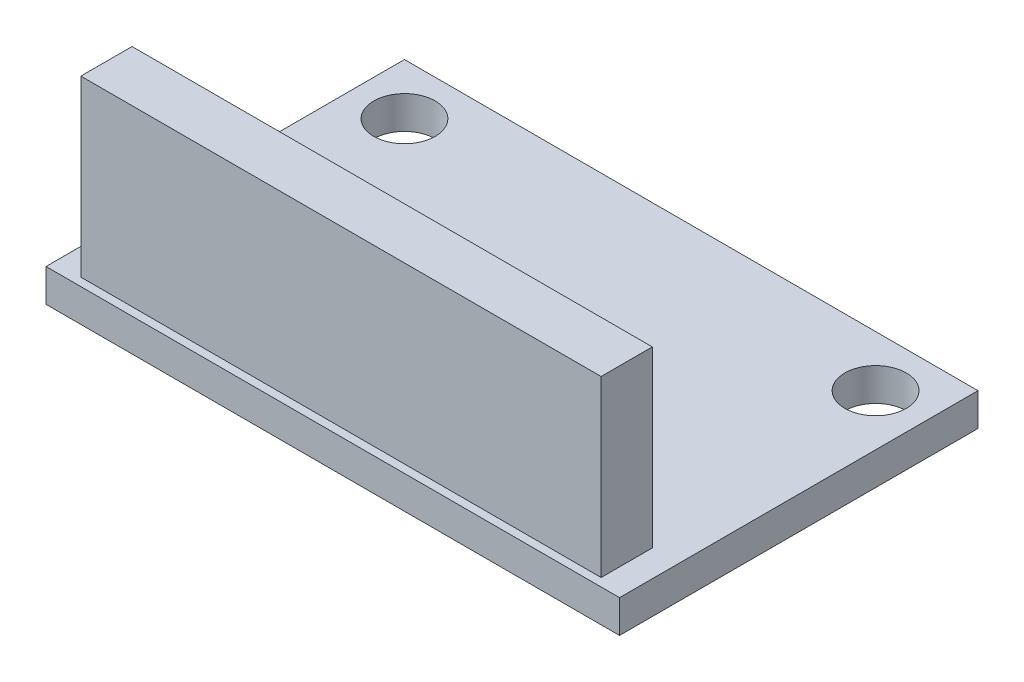
ISO-10303-21;
HEADER;
FILE_DESCRIPTION(('STEP AP214'),'2;1');
FILE_NAME('part.step','',(''),(''),'','','');
FILE_SCHEMA(('AUTOMOTIVE_DESIGN { 1 0 10303 214 1 1 1 1 }'));
ENDSEC;
DATA;
#1=APPLICATION_CONTEXT('core data for automotive mechanical design processes');
#2=APPLICATION_PROTOCOL_DEFINITION('international standard','automotive_design',2000,#1);
#3=PRODUCT_CONTEXT('',#1,'mechanical');
#4=PRODUCT('Part','Part','',(#3));
#5=PRODUCT_RELATED_PRODUCT_CATEGORY('part','',(#4));
#6=PRODUCT_DEFINITION_FORMATION('','',#4);
#7=PRODUCT_DEFINITION_CONTEXT('part definition',#1,'design');
#8=PRODUCT_DEFINITION('design','',#6,#7);
#9=PRODUCT_DEFINITION_SHAPE('','',#8);
#10=(LENGTH_UNIT() NAMED_UNIT(*) SI_UNIT(.MILLI.,.METRE.));
#11=(NAMED_UNIT(*) PLANE_ANGLE_UNIT() SI_UNIT($,.RADIAN.));
#12=(NAMED_UNIT(*) SI_UNIT($,.STERADIAN.) SOLID_ANGLE_UNIT());
#13=UNCERTAINTY_MEASURE_WITH_UNIT(LENGTH_MEASURE(1.E-05),#10,'distance_accuracy_value','');
#14=(GEOMETRIC_REPRESENTATION_CONTEXT(3) GLOBAL_UNCERTAINTY_ASSIGNED_CONTEXT((#13)) GLOBAL_UNIT_ASSIGNED_CONTEXT((#10,
#11,#12)) REPRESENTATION_CONTEXT('',''));
#15=CARTESIAN_POINT('',(0.,0.,0.));
#16=DIRECTION('',(0.,0.,1.));
#17=DIRECTION('',(1.,0.,0.));
#18=AXIS2_PLACEMENT_3D('',#15,#16,#17);
#19=CARTESIAN_POINT('',(0.,1.6,0.));
#20=DIRECTION('',(0.,-1.,0.));
#21=DIRECTION('',(0.,0.,-1.));
#22=AXIS2_PLACEMENT_3D('',#19,#20,#21);
#23=PLANE('',#22);
#24=DIRECTION('',(0.,0.,1.));
#25=VECTOR('',#24,1.);
#26=CARTESIAN_POINT('',(11.,1.6,-6.5));
#27=LINE('',#26,#25);
#28=CARTESIAN_POINT('',(11.,1.6,-9.5));
#29=VERTEX_POINT('',#28);
#30=CARTESIAN_POINT('',(11.,1.6,-6.5));
#31=VERTEX_POINT('',#30);
#32=EDGE_CURVE('E193',#29,#31,#27,.T.);
#33=ORIENTED_EDGE('',*,*,#32,.F.);
#34=DIRECTION('',(-1.,0.,0.));
#35=VECTOR('',#34,1.);
#36=CARTESIAN_POINT('',(11.,1.6,-9.5));
#37=LINE('',#36,#35);
#38=CARTESIAN_POINT('',(16.,1.6,-9.5));
#39=VERTEX_POINT('',#38);
#40=EDGE_CURVE('E210',#39,#29,#37,.T.);
#41=ORIENTED_EDGE('',*,*,#40,.F.);
#42=DIRECTION('',(0.,0.,-1.));
#43=VECTOR('',#42,1.);
#44=CARTESIAN_POINT('',(16.,1.6,-6.5));
#45=LINE('',#44,#43);
#46=CARTESIAN_POINT('',(16.,1.6,-6.5));
#47=VERTEX_POINT('',#46);
#48=EDGE_CURVE('E219',#47,#39,#45,.T.);
#49=ORIENTED_EDGE('',*,*,#48,.F.);
#50=DIRECTION('',(1.,0.,0.));
#51=VECTOR('',#50,1.);
#52=CARTESIAN_POINT('',(11.,1.6,-6.5));
#53=LINE('',#52,#51);
#54=EDGE_CURVE('E198',#31,#47,#53,.T.);
#55=ORIENTED_EDGE('',*,*,#54,.F.);
#56=EDGE_LOOP('',(#33,#41,#49,#55));
#57=FACE_BOUND('',#56,.T.);
#58=DIRECTION('',(0.,0.,1.));
#59=VECTOR('',#58,1.);
#60=CARTESIAN_POINT('',(0.,1.6,0.));
#61=LINE('',#60,#59);
#62=CARTESIAN_POINT('',(0.,1.6,-17.5));
#63=VERTEX_POINT('',#62);
#64=CARTESIAN_POINT('',(0.,1.6,0.));
#65=VERTEX_POINT('',#64);
#66=EDGE_CURVE('E306',#63,#65,#61,.T.);
#67=ORIENTED_EDGE('',*,*,#66,.T.);
#68=DIRECTION('',(1.,0.,0.));
#69=VECTOR('',#68,1.);
#70=CARTESIAN_POINT('',(0.,1.6,0.));
#71=LINE('',#70,#69);
#72=CARTESIAN_POINT('',(28.,1.6,0.));
#73=VERTEX_POINT('',#72);
#74=EDGE_CURVE('E382',#65,#73,#71,.T.);
#75=ORIENTED_EDGE('',*,*,#74,.T.);
#76=DIRECTION('',(0.,0.,-1.));
#77=VECTOR('',#76,1.);
#78=CARTESIAN_POINT('',(28.,1.6,0.));
#79=LINE('',#78,#77);
#80=CARTESIAN_POINT('',(28.,1.6,-17.5));
#81=VERTEX_POINT('',#80);
#82=EDGE_CURVE('E356',#73,#81,#79,.T.);
#83=ORIENTED_EDGE('',*,*,#82,.T.);
#84=DIRECTION('',(-1.,0.,0.));
#85=VECTOR('',#84,1.);
#86=CARTESIAN_POINT('',(0.,1.6,-17.5));
#87=LINE('',#86,#85);
#88=EDGE_CURVE('E374',#81,#63,#87,.T.);
#89=ORIENTED_EDGE('',*,*,#88,.T.);
#90=EDGE_LOOP('',(#67,#75,#83,#89));
#91=FACE_BOUND('',#90,.T.);
#92=CARTESIAN_POINT('',(2.5,1.6,-15.));
#93=DIRECTION('',(0.,1.,0.));
#94=DIRECTION('',(0.,0.,1.));
#95=AXIS2_PLACEMENT_3D('',#92,#93,#94);
#96=CIRCLE('',#95,1.5);
#97=CARTESIAN_POINT('',(2.5,1.6,-13.5));
#98=VERTEX_POINT('',#97);
#99=EDGE_CURVE('E293',#98,#98,#96,.T.);
#100=ORIENTED_EDGE('',*,*,#99,.F.);
#101=EDGE_LOOP('',(#100));
#102=FACE_BOUND('',#101,.T.);
#103=CARTESIAN_POINT('',(25.5,1.6,-15.));
#104=DIRECTION('',(0.,1.,0.));
#105=DIRECTION('',(0.,0.,1.));
#106=AXIS2_PLACEMENT_3D('',#103,#104,#105);
#107=CIRCLE('',#106,1.5);
#108=CARTESIAN_POINT('',(25.5,1.6,-13.5));
#109=VERTEX_POINT('',#108);
#110=EDGE_CURVE('E290',#109,#109,#107,.T.);
#111=ORIENTED_EDGE('',*,*,#110,.F.);
#112=EDGE_LOOP('',(#111));
#113=FACE_BOUND('',#112,.T.);
#114=DIRECTION('',(0.,0.,1.));
#115=VECTOR('',#114,1.);
#116=CARTESIAN_POINT('',(1.3,1.6,-0.4));
#117=LINE('',#116,#115);
#118=CARTESIAN_POINT('',(1.3,1.6,-2.9));
#119=VERTEX_POINT('',#118);
#120=CARTESIAN_POINT('',(1.3,1.6,-0.4));
#121=VERTEX_POINT('',#120);
#122=EDGE_CURVE('E245',#119,#121,#117,.T.);
#123=ORIENTED_EDGE('',*,*,#122,.F.);
#124=DIRECTION('',(-1.,0.,0.));
#125=VECTOR('',#124,1.);
#126=CARTESIAN_POINT('',(1.3,1.6,-2.9));
#127=LINE('',#126,#125);
#128=CARTESIAN_POINT('',(26.7,1.6,-2.9));
#129=VERTEX_POINT('',#128);
#130=EDGE_CURVE('E246',#129,#119,#127,.T.);
#131=ORIENTED_EDGE('',*,*,#130,.F.);
#132=DIRECTION('',(0.,0.,-1.));
#133=VECTOR('',#132,1.);
#134=CARTESIAN_POINT('',(26.7,1.6,-0.4));
#135=LINE('',#134,#133);
#136=CARTESIAN_POINT('',(26.7,1.6,-0.4));
#137=VERTEX_POINT('',#136);
#138=EDGE_CURVE('E264',#137,#129,#135,.T.);
#139=ORIENTED_EDGE('',*,*,#138,.F.);
#140=DIRECTION('',(1.,0.,0.));
#141=VECTOR('',#140,1.);
#142=CARTESIAN_POINT('',(1.3,1.6,-0.4));
#143=LINE('',#142,#141);
#144=EDGE_CURVE('E261',#121,#137,#143,.T.);
#145=ORIENTED_EDGE('',*,*,#144,.F.);
#146=EDGE_LOOP('',(#123,#131,#139,#145));
#147=FACE_BOUND('',#146,.T.);
#148=DIRECTION('',(0.,0.,1.));
#149=VECTOR('',#148,1.);
#150=CARTESIAN_POINT('',(17.5,1.6,-6.5));
#151=LINE('',#150,#149);
#152=CARTESIAN_POINT('',(17.5,1.6,-7.7));
#153=VERTEX_POINT('',#152);
#154=CARTESIAN_POINT('',(17.5,1.6,-6.5));
#155=VERTEX_POINT('',#154);
#156=EDGE_CURVE('E188',#153,#155,#151,.T.);
#157=ORIENTED_EDGE('',*,*,#156,.F.);
#158=DIRECTION('',(-1.,0.,0.));
#159=VECTOR('',#158,1.);
#160=CARTESIAN_POINT('',(17.5,1.6,-7.7));
#161=LINE('',#160,#159);
#162=CARTESIAN_POINT('',(19.5,1.6,-7.7));
#163=VERTEX_POINT('',#162);
#164=EDGE_CURVE('E186',#163,#153,#161,.T.);
#165=ORIENTED_EDGE('',*,*,#164,.F.);
#166=DIRECTION('',(0.,0.,-1.));
#167=VECTOR('',#166,1.);
#168=CARTESIAN_POINT('',(19.5,1.6,-6.5));
#169=LINE('',#168,#167);
#170=CARTESIAN_POINT('',(19.5,1.6,-6.5));
#171=VERTEX_POINT('',#170);
#172=EDGE_CURVE('E74',#171,#163,#169,.T.);
#173=ORIENTED_EDGE('',*,*,#172,.F.);
#174=DIRECTION('',(1.,0.,0.));
#175=VECTOR('',#174,1.);
#176=CARTESIAN_POINT('',(17.5,1.6,-6.5));
#177=LINE('',#176,#175);
#178=EDGE_CURVE('E69',#155,#171,#177,.T.);
#179=ORIENTED_EDGE('',*,*,#178,.F.);
#180=EDGE_LOOP('',(#157,#165,#173,#179));
#181=FACE_BOUND('',#180,.T.);
#182=ADVANCED_FACE('F47',(#57,#91,#102,#113,#147,#181),#23,.F.);
#183=CARTESIAN_POINT('',(0.,0.,0.));
#184=DIRECTION('',(0.,-1.,0.));
#185=DIRECTION('',(0.,0.,-1.));
#186=AXIS2_PLACEMENT_3D('',#183,#184,#185);
#187=PLANE('',#186);
#188=CARTESIAN_POINT('',(25.5,0.,-15.));
#189=DIRECTION('',(0.,-1.,0.));
#190=DIRECTION('',(0.,0.,-1.));
#191=AXIS2_PLACEMENT_3D('',#188,#189,#190);
#192=CIRCLE('',#191,1.5);
#193=CARTESIAN_POINT('',(25.5,0.,-16.5));
#194=VERTEX_POINT('',#193);
#195=EDGE_CURVE('E292',#194,#194,#192,.T.);
#196=ORIENTED_EDGE('',*,*,#195,.F.);
#197=EDGE_LOOP('',(#196));
#198=FACE_BOUND('',#197,.T.);
#199=DIRECTION('',(0.,0.,1.));
#200=VECTOR('',#199,1.);
#201=CARTESIAN_POINT('',(0.,0.,0.));
#202=LINE('',#201,#200);
#203=CARTESIAN_POINT('',(0.,0.,-17.5));
#204=VERTEX_POINT('',#203);
#205=CARTESIAN_POINT('',(0.,0.,0.));
#206=VERTEX_POINT('',#205);
#207=EDGE_CURVE('E353',#204,#206,#202,.T.);
#208=ORIENTED_EDGE('',*,*,#207,.F.);
#209=DIRECTION('',(-1.,0.,0.));
#210=VECTOR('',#209,1.);
#211=CARTESIAN_POINT('',(0.,0.,-17.5));
#212=LINE('',#211,#210);
#213=CARTESIAN_POINT('',(28.,0.,-17.5));
#214=VERTEX_POINT('',#213);
#215=EDGE_CURVE('E365',#214,#204,#212,.T.);
#216=ORIENTED_EDGE('',*,*,#215,.F.);
#217=DIRECTION('',(0.,0.,-1.));
#218=VECTOR('',#217,1.);
#219=CARTESIAN_POINT('',(28.,0.,0.));
#220=LINE('',#219,#218);
#221=CARTESIAN_POINT('',(28.,0.,0.));
#222=VERTEX_POINT('',#221);
#223=EDGE_CURVE('E352',#222,#214,#220,.T.);
#224=ORIENTED_EDGE('',*,*,#223,.F.);
#225=DIRECTION('',(1.,0.,0.));
#226=VECTOR('',#225,1.);
#227=CARTESIAN_POINT('',(0.,0.,0.));
#228=LINE('',#227,#226);
#229=EDGE_CURVE('E344',#206,#222,#228,.T.);
#230=ORIENTED_EDGE('',*,*,#229,.F.);
#231=EDGE_LOOP('',(#208,#216,#224,#230));
#232=FACE_BOUND('',#231,.T.);
#233=CARTESIAN_POINT('',(2.5,0.,-13.5));
#234=CARTESIAN_POINT('',(2.52473476852017,0.,-13.4999980826802));
#235=CARTESIAN_POINT('',(2.5494707785275,0.,-13.5005895208856));
#236=CARTESIAN_POINT('',(2.59871128510803,0.,-13.5029702628292));
#237=CARTESIAN_POINT('',(2.62321619008288,0.,-13.5047511511846));
#238=CARTESIAN_POINT('',(2.67199479323902,0.,-13.5095103395863));
#239=CARTESIAN_POINT('',(2.69626903668274,0.,-13.5124830301223));
#240=CARTESIAN_POINT('',(2.74458604299898,0.,-13.5196223185799));
#241=CARTESIAN_POINT('',(2.7686292015088,0.,-13.523786237845));
#242=CARTESIAN_POINT('',(2.81648427918419,0.,-13.5333052012687));
#243=CARTESIAN_POINT('',(2.84029614420126,0.,-13.5386605176519));
#244=CARTESIAN_POINT('',(2.88768916255095,0.,-13.5505591453594));
#245=CARTESIAN_POINT('',(2.91126952247937,0.,-13.5571056152043));
#246=CARTESIAN_POINT('',(2.95820019306488,0.,-13.5713841370317));
#247=CARTESIAN_POINT('',(2.98154870748109,0.,-13.5791220881609));
#248=CARTESIAN_POINT('',(3.02801723618735,0.,-13.5957791895752));
#249=CARTESIAN_POINT('',(3.05113423399139,0.,-13.6047067440334));
#250=CARTESIAN_POINT('',(3.09686336053347,0.,-13.6236328462026));
#251=CARTESIAN_POINT('',(3.11947652911217,0.,-13.6336288808049));
#252=CARTESIAN_POINT('',(3.16403406458079,0.,-13.6546460447501));
#253=CARTESIAN_POINT('',(3.18598193419866,0.,-13.6656597395951));
#254=CARTESIAN_POINT('',(3.22921011776691,0.,-13.6887078701635));
#255=CARTESIAN_POINT('',(3.25049296316462,0.,-13.7007375562716));
#256=CARTESIAN_POINT('',(3.2923920024617,0.,-13.7258153814986));
#257=CARTESIAN_POINT('',(3.31300944998675,0.,-13.7388614255848));
#258=CARTESIAN_POINT('',(3.35357904909081,0.,-13.7659692031202));
#259=CARTESIAN_POINT('',(3.37353089224229,0.,-13.7800313981341));
#260=CARTESIAN_POINT('',(3.41277098771515,0.,-13.8091688454879));
#261=CARTESIAN_POINT('',(3.43205712993003,0.,-13.8242469388043));
#262=CARTESIAN_POINT('',(3.46996730836356,0.,-13.855414262553));
#263=CARTESIAN_POINT('',(3.48858724864184,0.,-13.8715084726161));
#264=CARTESIAN_POINT('',(3.52516839349348,0.,-13.9047043306774));
#265=CARTESIAN_POINT('',(3.54312341285186,0.,-13.9218127889286));
#266=CARTESIAN_POINT('',(3.57814252919733,0.,-13.956812496153));
#267=CARTESIAN_POINT('',(3.59520921716561,0.,-13.9747011521588));
#268=CARTESIAN_POINT('',(3.62833220882842,0.,-14.0111697936334));
#269=CARTESIAN_POINT('',(3.64439459506978,0.,-14.0297442495724));
#270=CARTESIAN_POINT('',(3.67551206025703,0.,-14.0675806863673));
#271=CARTESIAN_POINT('',(3.69057129531392,0.,-14.0868392481334));
#272=CARTESIAN_POINT('',(3.71968410022333,0.,-14.1260421974695));
#273=CARTESIAN_POINT('',(3.73373963003818,0.,-14.1459851291946));
#274=CARTESIAN_POINT('',(3.76084735271726,0.,-14.1865547656844));
#275=CARTESIAN_POINT('',(3.77389908400018,0.,-14.2071817788474));
#276=CARTESIAN_POINT('',(3.79900178729558,0.,-14.2491178039128));
#277=CARTESIAN_POINT('',(3.81104972262619,0.,-14.2704286330354));
#278=CARTESIAN_POINT('',(3.83414694196366,0.,-14.3137310828954));
#279=CARTESIAN_POINT('',(3.84519053619433,0.,-14.3357257367618));
#280=CARTESIAN_POINT('',(3.86628360233902,0.,-14.380393708617));
#281=CARTESIAN_POINT('',(3.87632475368795,0.,-14.4030709514804));
#282=CARTESIAN_POINT('',(3.89528439042207,0.,-14.448807700282));
#283=CARTESIAN_POINT('',(3.90420626184726,0.,-14.4718658021565));
#284=CARTESIAN_POINT('',(3.92085197100997,0.,-14.51823405373));
#285=CARTESIAN_POINT('',(3.92858354434745,0.,-14.5415414224996));
#286=CARTESIAN_POINT('',(3.94285295603563,0.,-14.5884058704227));
#287=CARTESIAN_POINT('',(3.94939594256118,0.,-14.6119613812241));
#288=CARTESIAN_POINT('',(3.96129034794042,0.,-14.6593211718381));
#289=CARTESIAN_POINT('',(3.9666441346909,0.,-14.6831248566705));
#290=CARTESIAN_POINT('',(3.97616307710533,0.,-14.7309799898233));
#291=CARTESIAN_POINT('',(3.9803276883048,0.,-14.7550315464271));
#292=CARTESIAN_POINT('',(3.98747134007836,0.,-14.8033817703186));
#293=CARTESIAN_POINT('',(3.99044687970416,0.,-14.8276809544111));
#294=CARTESIAN_POINT('',(3.99521479776574,0.,-14.8765261247185));
#295=CARTESIAN_POINT('',(3.99700075880555,0.,-14.9010727357961));
#296=CARTESIAN_POINT('',(3.99939451810823,0.,-14.9504125277033));
#297=CARTESIAN_POINT('',(3.99999312718683,0.,-14.9752061505017));
#298=CARTESIAN_POINT('',(4.00000685149273,0.,-15.0247169354649));
#299=CARTESIAN_POINT('',(3.99942563232503,0.,-15.0494340962254));
#300=CARTESIAN_POINT('',(3.99705990065969,0.,-15.098642811929));
#301=CARTESIAN_POINT('',(3.99528359914018,0.,-15.1231347579143));
#302=CARTESIAN_POINT('',(3.99053256875276,0.,-15.1718925295955));
#303=CARTESIAN_POINT('',(3.98756319636062,0.,-15.1961588764443));
#304=CARTESIAN_POINT('',(3.98042838681365,0.,-15.244465409533));
#305=CARTESIAN_POINT('',(3.97626536499926,0.,-15.2685059522379));
#306=CARTESIAN_POINT('',(3.96674635445589,0.,-15.316361071839));
#307=CARTESIAN_POINT('',(3.96138982126907,0.,-15.3401755404186));
#308=CARTESIAN_POINT('',(3.94948686529562,0.,-15.3875790798446));
#309=CARTESIAN_POINT('',(3.9429370102819,0.,-15.4111672884015));
#310=CARTESIAN_POINT('',(3.92864975476398,0.,-15.4581189447596));
#311=CARTESIAN_POINT('',(3.92090618623437,0.,-15.4814805140276));
#312=CARTESIAN_POINT('',(3.90423621054066,0.,-15.5279805899351));
#313=CARTESIAN_POINT('',(3.89530114454309,0.,-15.5511159883522));
#314=CARTESIAN_POINT('',(3.87636686701958,0.,-15.5968632412828));
#315=CARTESIAN_POINT('',(3.86637104260849,0.,-15.6194764972651));
#316=CARTESIAN_POINT('',(3.84535403131573,0.,-15.6640340962111));
#317=CARTESIAN_POINT('',(3.83434028074335,0.,-15.6859819426558));
#318=CARTESIAN_POINT('',(3.81129210958862,0.,-15.729210109347));
#319=CARTESIAN_POINT('',(3.79926243830806,0.,-15.7504929609104));
#320=CARTESIAN_POINT('',(3.77418462391119,0.,-15.792392004711));
#321=CARTESIAN_POINT('',(3.76113857586527,0.,-15.8130094505895));
#322=CARTESIAN_POINT('',(3.73403079542929,0.,-15.8535790484874));
#323=CARTESIAN_POINT('',(3.71996860147678,0.,-15.8735308920802));
#324=CARTESIAN_POINT('',(3.69083115490272,0.,-15.9127709878773));
#325=CARTESIAN_POINT('',(3.67575306130075,0.,-15.9320571299735));
#326=CARTESIAN_POINT('',(3.64458573734164,0.,-15.9699673083196));
#327=CARTESIAN_POINT('',(3.62849152735564,0.,-15.9885872486299));
#328=CARTESIAN_POINT('',(3.5952956693512,0.,-16.0251683935053));
#329=CARTESIAN_POINT('',(3.57818721107903,0.,-16.043123412855));
#330=CARTESIAN_POINT('',(3.5431875038395,0.,-16.0781425291941));
#331=CARTESIAN_POINT('',(3.52529884783932,0.,-16.0952092171646));
#332=CARTESIAN_POINT('',(3.48883020636891,0.,-16.128332208829));
#333=CARTESIAN_POINT('',(3.47025575042847,0.,-16.1443945950697));
#334=CARTESIAN_POINT('',(3.43241931363264,0.,-16.1755120602564));
#335=CARTESIAN_POINT('',(3.41316075186691,0.,-16.1905712953134));
#336=CARTESIAN_POINT('',(3.37395780253116,0.,-16.2196841002229));
#337=CARTESIAN_POINT('',(3.35401487080599,0.,-16.2337396300377));
#338=CARTESIAN_POINT('',(3.31344523431614,0.,-16.2608473527167));
#339=CARTESIAN_POINT('',(3.29281822115309,0.,-16.2738990839997));
#340=CARTESIAN_POINT('',(3.25088219608766,0.,-16.2990017872951));
#341=CARTESIAN_POINT('',(3.22957136696504,0.,-16.3110497226258));
#342=CARTESIAN_POINT('',(3.18626891710494,0.,-16.3341469419633));
#343=CARTESIAN_POINT('',(3.16427426323847,0.,-16.345190536194));
#344=CARTESIAN_POINT('',(3.11960629138316,0.,-16.3662836023389));
#345=CARTESIAN_POINT('',(3.09692904851967,0.,-16.3763247536879));
#346=CARTESIAN_POINT('',(3.05119229971807,0.,-16.3952843904221));
#347=CARTESIAN_POINT('',(3.02813419784369,0.,-16.4042062618473));
#348=CARTESIAN_POINT('',(2.98176594627034,0.,-16.42085197101));
#349=CARTESIAN_POINT('',(2.95845857750085,0.,-16.4285835443475));
#350=CARTESIAN_POINT('',(2.91159412957785,0.,-16.4428529560356));
#351=CARTESIAN_POINT('',(2.88803861877647,0.,-16.4493959425612));
#352=CARTESIAN_POINT('',(2.84067882816255,0.,-16.4612903479404));
#353=CARTESIAN_POINT('',(2.81687514333016,0.,-16.4666441346909));
#354=CARTESIAN_POINT('',(2.76902001017735,0.,-16.4761630771053));
#355=CARTESIAN_POINT('',(2.7449684535735,0.,-16.4803276883048));
#356=CARTESIAN_POINT('',(2.69661822968193,0.,-16.4874713400784));
#357=CARTESIAN_POINT('',(2.67231904558947,0.,-16.4904468797042));
#358=CARTESIAN_POINT('',(2.62347387528196,0.,-16.4952147977657));
#359=CARTESIAN_POINT('',(2.59892726420421,0.,-16.4970007588055));
#360=CARTESIAN_POINT('',(2.54958747229691,0.,-16.4993945181082));
#361=CARTESIAN_POINT('',(2.52479384949843,0.,-16.4999931271868));
#362=CARTESIAN_POINT('',(2.4752830645351,0.,-16.5000068514927));
#363=CARTESIAN_POINT('',(2.45056590377459,0.,-16.499425632325));
#364=CARTESIAN_POINT('',(2.40135718807092,0.,-16.4970599006597));
#365=CARTESIAN_POINT('',(2.37686524208567,0.,-16.4952835991402));
#366=CARTESIAN_POINT('',(2.32810747040439,0.,-16.4905325687528));
#367=CARTESIAN_POINT('',(2.30384112355559,0.,-16.4875631963606));
#368=CARTESIAN_POINT('',(2.25553459046684,0.,-16.4804283868137));
#369=CARTESIAN_POINT('',(2.23149404776201,0.,-16.4762653649993));
#370=CARTESIAN_POINT('',(2.18363892816088,0.,-16.4667463544559));
#371=CARTESIAN_POINT('',(2.15982445958129,0.,-16.4613898212691));
#372=CARTESIAN_POINT('',(2.11242092015526,0.,-16.4494868652956));
#373=CARTESIAN_POINT('',(2.08883271159841,0.,-16.4429370102819));
#374=CARTESIAN_POINT('',(2.04188105524034,0.,-16.428649754764));
#375=CARTESIAN_POINT('',(2.01851948597238,0.,-16.4209061862344));
#376=CARTESIAN_POINT('',(1.97201941006483,0.,-16.4042362105407));
#377=CARTESIAN_POINT('',(1.94888401164777,0.,-16.3953011445431));
#378=CARTESIAN_POINT('',(1.90313675871714,0.,-16.3763668670195));
#379=CARTESIAN_POINT('',(1.88052350273471,0.,-16.3663710426084));
#380=CARTESIAN_POINT('',(1.8359659037886,0.,-16.3453540313156));
#381=CARTESIAN_POINT('',(1.81401805734381,0.,-16.3343402807432));
#382=CARTESIAN_POINT('',(1.77078989065249,0.,-16.3112921095884));
#383=CARTESIAN_POINT('',(1.74950703908904,0.,-16.2992624383078));
#384=CARTESIAN_POINT('',(1.70760799528844,0.,-16.2741846239109));
#385=CARTESIAN_POINT('',(1.68699054940992,0.,-16.261138575865));
#386=CARTESIAN_POINT('',(1.64642095151201,0.,-16.234030795429));
#387=CARTESIAN_POINT('',(1.62646910791921,0.,-16.2199686014765));
#388=CARTESIAN_POINT('',(1.58722901212215,0.,-16.1908311549025));
#389=CARTESIAN_POINT('',(1.56794287002603,0.,-16.1757530613005));
#390=CARTESIAN_POINT('',(1.53003269168004,0.,-16.1445857373415));
#391=CARTESIAN_POINT('',(1.51141275136973,0.,-16.1284915273555));
#392=CARTESIAN_POINT('',(1.47483160649452,0.,-16.0952956693511));
#393=CARTESIAN_POINT('',(1.45687658714491,0.,-16.078187211079));
#394=CARTESIAN_POINT('',(1.42185747080579,0.,-16.0431875038393));
#395=CARTESIAN_POINT('',(1.40479078283516,0.,-16.025298847839));
#396=CARTESIAN_POINT('',(1.3716677911706,0.,-15.9888302063683));
#397=CARTESIAN_POINT('',(1.35560540492982,0.,-15.9702557504278));
#398=CARTESIAN_POINT('',(1.32448793974297,0.,-15.9324193136317));
#399=CARTESIAN_POINT('',(1.30942870468589,0.,-15.913160751866));
#400=CARTESIAN_POINT('',(1.28031589977634,0.,-15.8739578025301));
#401=CARTESIAN_POINT('',(1.26626036996153,0.,-15.8540148708049));
#402=CARTESIAN_POINT('',(1.23915264728248,0.,-15.8134452343151));
#403=CARTESIAN_POINT('',(1.22610091599956,0.,-15.792818221152));
#404=CARTESIAN_POINT('',(1.20099821270418,0.,-15.7508821960867));
#405=CARTESIAN_POINT('',(1.18895027737359,0.,-15.7295713669641));
#406=CARTESIAN_POINT('',(1.16585305803616,0.,-15.6862689171042));
#407=CARTESIAN_POINT('',(1.15480946380552,0.,-15.6642742632379));
#408=CARTESIAN_POINT('',(1.1337163976609,0.,-15.6196062913828));
#409=CARTESIAN_POINT('',(1.12367524631201,0.,-15.5969290485195));
#410=CARTESIAN_POINT('',(1.10471560957792,0.,-15.5511922997179));
#411=CARTESIAN_POINT('',(1.09579373815272,0.,-15.5281341978434));
#412=CARTESIAN_POINT('',(1.07914802899,0.,-15.4817659462698));
#413=CARTESIAN_POINT('',(1.07141645565251,0.,-15.4584585775002));
#414=CARTESIAN_POINT('',(1.05714704396432,0.,-15.4115941295771));
#415=CARTESIAN_POINT('',(1.05060405743877,0.,-15.3880386187756));
#416=CARTESIAN_POINT('',(1.03870965205952,0.,-15.3406788281616));
#417=CARTESIAN_POINT('',(1.03335586530904,0.,-15.3168751433292));
#418=CARTESIAN_POINT('',(1.02383692289461,0.,-15.2690200101764));
#419=CARTESIAN_POINT('',(1.01967231169514,0.,-15.2449684535726));
#420=CARTESIAN_POINT('',(1.01252865992158,0.,-15.1966182296811));
#421=CARTESIAN_POINT('',(1.00955312029579,0.,-15.1723190455887));
#422=CARTESIAN_POINT('',(1.00478520223422,0.,-15.1234738752813));
#423=CARTESIAN_POINT('',(1.00299924119442,0.,-15.0989272642037));
#424=CARTESIAN_POINT('',(1.00060548189175,0.,-15.0495874722966));
#425=CARTESIAN_POINT('',(1.00000687281316,0.,-15.0247938494983));
#426=CARTESIAN_POINT('',(0.999993148507278,0.,-14.9752830645351));
#427=CARTESIAN_POINT('',(1.00057436767499,0.,-14.9505659037746));
#428=CARTESIAN_POINT('',(1.00294009934035,0.,-14.9013571880709));
#429=CARTESIAN_POINT('',(1.00471640085986,0.,-14.8768652420856));
#430=CARTESIAN_POINT('',(1.00946743124729,0.,-14.8281074704044));
#431=CARTESIAN_POINT('',(1.01243680363943,0.,-14.8038411235556));
#432=CARTESIAN_POINT('',(1.01957161318641,0.,-14.7555345904668));
#433=CARTESIAN_POINT('',(1.02373463500081,0.,-14.731494047762));
#434=CARTESIAN_POINT('',(1.03325364554417,0.,-14.6836389281608));
#435=CARTESIAN_POINT('',(1.03861017873099,0.,-14.6598244595813));
#436=CARTESIAN_POINT('',(1.05051313470444,0.,-14.6124209201552));
#437=CARTESIAN_POINT('',(1.05706298971815,0.,-14.5888327115984));
#438=CARTESIAN_POINT('',(1.07135024523606,0.,-14.5418810552403));
#439=CARTESIAN_POINT('',(1.07909381376566,0.,-14.5185194859724));
#440=CARTESIAN_POINT('',(1.09576378945936,0.,-14.4720194100648));
#441=CARTESIAN_POINT('',(1.10469885545692,0.,-14.4488840116478));
#442=CARTESIAN_POINT('',(1.12363313298042,0.,-14.4031367587172));
#443=CARTESIAN_POINT('',(1.13362895739151,0.,-14.3805235027349));
#444=CARTESIAN_POINT('',(1.15464596868429,0.,-14.3359659037889));
#445=CARTESIAN_POINT('',(1.16565971925667,0.,-14.3140180573442));
#446=CARTESIAN_POINT('',(1.18870789041139,0.,-14.2707898906529));
#447=CARTESIAN_POINT('',(1.20073756169196,0.,-14.2495070390895));
#448=CARTESIAN_POINT('',(1.22581537608883,0.,-14.207607995289));
#449=CARTESIAN_POINT('',(1.23886142413477,0.,-14.1869905494105));
#450=CARTESIAN_POINT('',(1.26596920457071,0.,-14.1464209515125));
#451=CARTESIAN_POINT('',(1.28003139852318,0.,-14.1264691079196));
#452=CARTESIAN_POINT('',(1.30916884509736,0.,-14.0872290121228));
#453=CARTESIAN_POINT('',(1.3242469386995,0.,-14.067942870027));
#454=CARTESIAN_POINT('',(1.35541426265814,0.,-14.0300326916799));
#455=CARTESIAN_POINT('',(1.37150847264352,0.,-14.011412751368));
#456=CARTESIAN_POINT('',(1.40470433064966,0.,-13.9748316064967));
#457=CARTESIAN_POINT('',(1.42181278892419,0.,-13.9568765871527));
#458=CARTESIAN_POINT('',(1.45681249615735,0.,-13.9218574707982));
#459=CARTESIAN_POINT('',(1.47470115214884,0.,-13.9047907828066));
#460=CARTESIAN_POINT('',(1.51116979364316,0.,-13.8716677911993));
#461=CARTESIAN_POINT('',(1.52974424961592,0.,-13.855605405036));
#462=CARTESIAN_POINT('',(1.56758068632374,0.,-13.8244879396379));
#463=CARTESIAN_POINT('',(1.58683924796982,0.,-13.8094287042939));
#464=CARTESIAN_POINT('',(1.62604219763249,0.,-13.7803159001684));
#465=CARTESIAN_POINT('',(1.64598512980309,0.,-13.7662603714219));
#466=CARTESIAN_POINT('',(1.68655476507525,0.,-13.7391526458223));
#467=CARTESIAN_POINT('',(1.70718177657422,0.,-13.7261009105483));
#468=CARTESIAN_POINT('',(1.74911780619238,0.,-13.7009982181722));
#469=CARTESIAN_POINT('',(1.77042864155484,0.,-13.6889502978072));
#470=CARTESIAN_POINT('',(1.81373107433014,0.,-13.6658530374938));
#471=CARTESIAN_POINT('',(1.83572570471355,0.,-13.6548093869417));
#472=CARTESIAN_POINT('',(1.88039374091221,0.,-13.6337164751177));
#473=CARTESIAN_POINT('',(1.90307107246164,0.,-13.6236755364723));
#474=CARTESIAN_POINT('',(1.9488259740816,0.,-13.6047076948578));
#475=CARTESIAN_POINT('',(1.97190250413236,0.,-13.5957782837643));
#476=CARTESIAN_POINT('',(2.01830235185527,0.,-13.579119653852));
#477=CARTESIAN_POINT('',(2.0416227956986,0.,-13.5713824418994));
#478=CARTESIAN_POINT('',(2.08850826063009,0.,-13.5571042684096));
#479=CARTESIAN_POINT('',(2.11207163070066,0.,-13.5505578885187));
#480=CARTESIAN_POINT('',(2.15944196283208,0.,-13.5386591292703));
#481=CARTESIAN_POINT('',(2.18324826081635,0.,-13.5333041075351));
#482=CARTESIAN_POINT('',(2.23110342111066,0.,-13.5237851564261));
#483=CARTESIAN_POINT('',(2.25515233756664,0.,-13.5196214993058));
#484=CARTESIAN_POINT('',(2.30349212816823,0.,-13.5124821979409));
#485=CARTESIAN_POINT('',(2.32778348028023,0.,-13.5095097916543));
#486=CARTESIAN_POINT('',(2.37660757695438,0.,-13.5047506011437));
#487=CARTESIAN_POINT('',(2.40114092052308,0.,-13.5029699870246));
#488=CARTESIAN_POINT('',(2.45044966261455,0.,-13.500589256812));
#489=CARTESIAN_POINT('',(2.47522549562094,0.,-13.4999981034953));
#490=CARTESIAN_POINT('',(2.5,0.,-13.5));
#491=B_SPLINE_CURVE_WITH_KNOTS('',3,(#233,#234,#235,#236,#237,#238,#239,#240,#241,#242,#243,
#244,#245,#246,#247,#248,#249,#250,#251,#252,#253,#254,#255,#256,#257,#258,#259,#260,#261,#262,
#263,#264,#265,#266,#267,#268,#269,#270,#271,#272,#273,#274,#275,#276,#277,#278,#279,#280,#281,
#282,#283,#284,#285,#286,#287,#288,#289,#290,#291,#292,#293,#294,#295,#296,#297,#298,#299,#300,
#301,#302,#303,#304,#305,#306,#307,#308,#309,#310,#311,#312,#313,#314,#315,#316,#317,#318,#319,
#320,#321,#322,#323,#324,#325,#326,#327,#328,#329,#330,#331,#332,#333,#334,#335,#336,#337,#338,
#339,#340,#341,#342,#343,#344,#345,#346,#347,#348,#349,#350,#351,#352,#353,#354,#355,#356,#357,
#358,#359,#360,#361,#362,#363,#364,#365,#366,#367,#368,#369,#370,#371,#372,#373,#374,#375,#376,
#377,#378,#379,#380,#381,#382,#383,#384,#385,#386,#387,#388,#389,#390,#391,#392,#393,#394,#395,
#396,#397,#398,#399,#400,#401,#402,#403,#404,#405,#406,#407,#408,#409,#410,#411,#412,#413,#414,
#415,#416,#417,#418,#419,#420,#421,#422,#423,#424,#425,#426,#427,#428,#429,#430,#431,#432,#433,
#434,#435,#436,#437,#438,#439,#440,#441,#442,#443,#444,#445,#446,#447,#448,#449,#450,#451,#452,
#453,#454,#455,#456,#457,#458,#459,#460,#461,#462,#463,#464,#465,#466,#467,#468,#469,#470,#471,
#472,#473,#474,#475,#476,#477,#478,#479,#480,#481,#482,#483,#484,#485,#486,#487,#488,#489,#490),
.UNSPECIFIED.,.F.,.F.,(4,2,2,2,2,2,2,2,2,2,2,2,2,2,2,2,2,2,2,2,2,2,2,2,2,2,2,2,2,2,2,2,2,2,2,2,
2,2,2,2,2,2,2,2,2,2,2,2,2,2,2,2,2,2,2,2,2,2,2,2,2,2,2,2,2,2,2,2,2,2,2,2,2,2,2,2,2,2,2,2,2,2,2,2,
2,2,2,2,2,2,2,2,2,2,2,2,2,2,2,2,2,2,2,2,2,2,2,2,2,2,2,2,2,2,2,2,2,2,2,2,2,2,2,2,2,2,2,2,4),(0.,
0.0741989708049532,0.14787846615862,0.221215167441846,0.294388239176711,0.367578047562877,
0.440964835396715,0.514727401499112,0.589041832398699,0.663185166529007,0.736824221437609,
0.810136292194254,0.883301050981154,0.956499254763663,1.02991141346063,1.10371646715638,
1.17809052013483,1.2522338542651,1.32587290917368,1.39918497993031,1.47234973871721,
1.54554794249972,1.6189601011967,1.69276515489249,1.76713920787098,1.84128254200126,
1.91492159690985,1.98823366766648,2.06139842645337,2.13459663023589,2.20800878893286,
2.28181384262864,2.35618789560711,2.43033122973738,2.50397028464594,2.57728235540257,
2.65044711418946,2.72364531797198,2.79705747666897,2.87086253036476,2.94523658334327,
3.01937991747346,3.09301897238199,3.16633104313858,3.23949580192547,3.31269400570799,
3.386106164405,3.45991121810084,3.53428527107939,3.60842860520934,3.68206766011768,
3.75537973087417,3.82854448966101,3.90174269344358,3.9751548521407,4.04895990583671,
4.12333395881552,4.19747729294554,4.27111634785393,4.34442841861044,4.4175931773973,
4.49079138117985,4.56420353987695,4.63800859357293,4.71238264655169,4.786525980682,
4.86016503559061,4.93347710634725,5.00664186513415,5.07984006891666,5.15325222761363,
5.22705728130939,5.30143133428785,5.37557466841834,5.44921372332707,5.5225257940838,
5.59569055287072,5.66888875665321,5.74230091535009,5.81610596904572,5.890480022024,
5.96462335615453,6.03826241106328,6.11157448182003,6.18473924060696,6.25793744438944,
6.33134960308631,6.40515465678191,6.47952870976014,6.55367204389055,6.62731109879923,
6.70062316955592,6.77378792834283,6.84698613212533,6.92039829082225,6.99420334451793,
7.06857739749627,7.1427207316266,7.21635978653522,7.28967185729187,7.36283661607877,
7.43603481986128,7.50944697855823,7.58325203225398,7.65762608523241,7.73176941936264,
7.80540847427118,7.87872054502778,7.95188530381467,8.02508350759719,8.09849566629419,
8.17230071999001,8.24667477296854,8.32081810709872,8.39445716200722,8.4677692327638,
8.54093399155068,8.61413219533321,8.68754435403024,8.7613494077261,8.83572346070469,
8.9099265258729,8.98360814499241,9.05694563133214,9.13011879991211,9.20330867686431,
9.27669616467639,9.35046071196913,9.42477903607617),.UNSPECIFIED.);
#492=CARTESIAN_POINT('',(2.5,0.,-13.5));
#493=VERTEX_POINT('',#492);
#494=EDGE_CURVE('E298',#493,#493,#491,.T.);
#495=ORIENTED_EDGE('',*,*,#494,.T.);
#496=EDGE_LOOP('',(#495));
#497=FACE_BOUND('',#496,.T.);
#498=ADVANCED_FACE('F322',(#198,#232,#497),#187,.T.);
#499=CARTESIAN_POINT('',(0.,1.6,0.));
#500=DIRECTION('',(1.,0.,0.));
#501=DIRECTION('',(0.,0.,-1.));
#502=AXIS2_PLACEMENT_3D('',#499,#500,#501);
#503=PLANE('',#502);
#504=ORIENTED_EDGE('',*,*,#207,.T.);
#505=DIRECTION('',(0.,-1.,0.));
#506=VECTOR('',#505,1.);
#507=CARTESIAN_POINT('',(0.,1.6,0.));
#508=LINE('',#507,#506);
#509=EDGE_CURVE('E11',#65,#206,#508,.T.);
#510=ORIENTED_EDGE('',*,*,#509,.F.);
#511=ORIENTED_EDGE('',*,*,#66,.F.);
#512=DIRECTION('',(0.,-1.,0.));
#513=VECTOR('',#512,1.);
#514=CARTESIAN_POINT('',(0.,1.6,-17.5));
#515=LINE('',#514,#513);
#516=EDGE_CURVE('E371',#63,#204,#515,.T.);
#517=ORIENTED_EDGE('',*,*,#516,.T.);
#518=EDGE_LOOP('',(#504,#510,#511,#517));
#519=FACE_BOUND('',#518,.T.);
#520=ADVANCED_FACE('F51',(#519),#503,.F.);
#521=CARTESIAN_POINT('',(0.,1.6,0.));
#522=DIRECTION('',(0.,0.,-1.));
#523=DIRECTION('',(-1.,0.,0.));
#524=AXIS2_PLACEMENT_3D('',#521,#522,#523);
#525=PLANE('',#524);
#526=ORIENTED_EDGE('',*,*,#229,.T.);
#527=DIRECTION('',(0.,-1.,0.));
#528=VECTOR('',#527,1.);
#529=CARTESIAN_POINT('',(28.,1.6,0.));
#530=LINE('',#529,#528);
#531=EDGE_CURVE('E61',#73,#222,#530,.T.);
#532=ORIENTED_EDGE('',*,*,#531,.F.);
#533=ORIENTED_EDGE('',*,*,#74,.F.);
#534=ORIENTED_EDGE('',*,*,#509,.T.);
#535=EDGE_LOOP('',(#526,#532,#533,#534));
#536=FACE_BOUND('',#535,.T.);
#537=ADVANCED_FACE('F333',(#536),#525,.F.);
#538=CARTESIAN_POINT('',(28.,1.6,0.));
#539=DIRECTION('',(-1.,0.,0.));
#540=DIRECTION('',(0.,0.,1.));
#541=AXIS2_PLACEMENT_3D('',#538,#539,#540);
#542=PLANE('',#541);
#543=ORIENTED_EDGE('',*,*,#223,.T.);
#544=DIRECTION('',(0.,-1.,0.));
#545=VECTOR('',#544,1.);
#546=CARTESIAN_POINT('',(28.,1.6,-17.5));
#547=LINE('',#546,#545);
#548=EDGE_CURVE('E357',#81,#214,#547,.T.);
#549=ORIENTED_EDGE('',*,*,#548,.F.);
#550=ORIENTED_EDGE('',*,*,#82,.F.);
#551=ORIENTED_EDGE('',*,*,#531,.T.);
#552=EDGE_LOOP('',(#543,#549,#550,#551));
#553=FACE_BOUND('',#552,.T.);
#554=ADVANCED_FACE('F335',(#553),#542,.F.);
#555=CARTESIAN_POINT('',(0.,1.6,-17.5));
#556=DIRECTION('',(0.,0.,1.));
#557=DIRECTION('',(1.,0.,0.));
#558=AXIS2_PLACEMENT_3D('',#555,#556,#557);
#559=PLANE('',#558);
#560=ORIENTED_EDGE('',*,*,#215,.T.);
#561=ORIENTED_EDGE('',*,*,#516,.F.);
#562=ORIENTED_EDGE('',*,*,#88,.F.);
#563=ORIENTED_EDGE('',*,*,#548,.T.);
#564=EDGE_LOOP('',(#560,#561,#562,#563));
#565=FACE_BOUND('',#564,.T.);
#566=ADVANCED_FACE('F321',(#565),#559,.F.);
#567=CARTESIAN_POINT('',(2.5,-1.2E-05,-15.));
#568=DIRECTION('',(0.,1.,0.));
#569=DIRECTION('',(0.,0.,1.));
#570=AXIS2_PLACEMENT_3D('',#567,#568,#569);
#571=CYLINDRICAL_SURFACE('',#570,1.5);
#572=ORIENTED_EDGE('',*,*,#494,.F.);
#573=EDGE_LOOP('',(#572));
#574=FACE_BOUND('',#573,.T.);
#575=ORIENTED_EDGE('',*,*,#99,.T.);
#576=EDGE_LOOP('',(#575));
#577=FACE_BOUND('',#576,.T.);
#578=ADVANCED_FACE('F309',(#574,#577),#571,.F.);
#579=CARTESIAN_POINT('',(25.5,-0.0788340793951557,-15.));
#580=DIRECTION('',(0.,1.,0.));
#581=DIRECTION('',(0.,0.,1.));
#582=AXIS2_PLACEMENT_3D('',#579,#580,#581);
#583=CYLINDRICAL_SURFACE('',#582,1.5);
#584=ORIENTED_EDGE('',*,*,#195,.T.);
#585=EDGE_LOOP('',(#584));
#586=FACE_BOUND('',#585,.T.);
#587=ORIENTED_EDGE('',*,*,#110,.T.);
#588=EDGE_LOOP('',(#587));
#589=FACE_BOUND('',#588,.T.);
#590=ADVANCED_FACE('F319',(#586,#589),#583,.F.);
#591=CARTESIAN_POINT('',(1.3,10.1,-0.4));
#592=DIRECTION('',(1.,0.,0.));
#593=DIRECTION('',(0.,0.,-1.));
#594=AXIS2_PLACEMENT_3D('',#591,#592,#593);
#595=PLANE('',#594);
#596=ORIENTED_EDGE('',*,*,#122,.T.);
#597=DIRECTION('',(0.,-1.,0.));
#598=VECTOR('',#597,1.);
#599=CARTESIAN_POINT('',(1.3,10.1,-0.4));
#600=LINE('',#599,#598);
#601=CARTESIAN_POINT('',(1.3,10.1,-0.4));
#602=VERTEX_POINT('',#601);
#603=EDGE_CURVE('E282',#602,#121,#600,.T.);
#604=ORIENTED_EDGE('',*,*,#603,.F.);
#605=DIRECTION('',(0.,0.,1.));
#606=VECTOR('',#605,1.);
#607=CARTESIAN_POINT('',(1.3,10.1,-0.4));
#608=LINE('',#607,#606);
#609=CARTESIAN_POINT('',(1.3,10.1,-2.9));
#610=VERTEX_POINT('',#609);
#611=EDGE_CURVE('E242',#610,#602,#608,.T.);
#612=ORIENTED_EDGE('',*,*,#611,.F.);
#613=DIRECTION('',(0.,-1.,0.));
#614=VECTOR('',#613,1.);
#615=CARTESIAN_POINT('',(1.3,10.1,-2.9));
#616=LINE('',#615,#614);
#617=EDGE_CURVE('E260',#610,#119,#616,.T.);
#618=ORIENTED_EDGE('',*,*,#617,.T.);
#619=EDGE_LOOP('',(#596,#604,#612,#618));
#620=FACE_BOUND('',#619,.T.);
#621=ADVANCED_FACE('F464',(#620),#595,.F.);
#622=CARTESIAN_POINT('',(1.3,10.1,-0.4));
#623=DIRECTION('',(0.,0.,-1.));
#624=DIRECTION('',(-1.,0.,0.));
#625=AXIS2_PLACEMENT_3D('',#622,#623,#624);
#626=PLANE('',#625);
#627=ORIENTED_EDGE('',*,*,#144,.T.);
#628=DIRECTION('',(0.,-1.,0.));
#629=VECTOR('',#628,1.);
#630=CARTESIAN_POINT('',(26.7,10.1,-0.4));
#631=LINE('',#630,#629);
#632=CARTESIAN_POINT('',(26.7,10.1,-0.4));
#633=VERTEX_POINT('',#632);
#634=EDGE_CURVE('E276',#633,#137,#631,.T.);
#635=ORIENTED_EDGE('',*,*,#634,.F.);
#636=DIRECTION('',(1.,0.,0.));
#637=VECTOR('',#636,1.);
#638=CARTESIAN_POINT('',(1.3,10.1,-0.4));
#639=LINE('',#638,#637);
#640=EDGE_CURVE('E250',#602,#633,#639,.T.);
#641=ORIENTED_EDGE('',*,*,#640,.F.);
#642=ORIENTED_EDGE('',*,*,#603,.T.);
#643=EDGE_LOOP('',(#627,#635,#641,#642));
#644=FACE_BOUND('',#643,.T.);
#645=ADVANCED_FACE('F465',(#644),#626,.F.);
#646=CARTESIAN_POINT('',(26.7,10.1,-0.4));
#647=DIRECTION('',(-1.,0.,0.));
#648=DIRECTION('',(0.,0.,1.));
#649=AXIS2_PLACEMENT_3D('',#646,#647,#648);
#650=PLANE('',#649);
#651=ORIENTED_EDGE('',*,*,#138,.T.);
#652=DIRECTION('',(0.,-1.,0.));
#653=VECTOR('',#652,1.);
#654=CARTESIAN_POINT('',(26.7,10.1,-2.9));
#655=LINE('',#654,#653);
#656=CARTESIAN_POINT('',(26.7,10.1,-2.9));
#657=VERTEX_POINT('',#656);
#658=EDGE_CURVE('E274',#657,#129,#655,.T.);
#659=ORIENTED_EDGE('',*,*,#658,.F.);
#660=DIRECTION('',(0.,0.,-1.));
#661=VECTOR('',#660,1.);
#662=CARTESIAN_POINT('',(26.7,10.1,-0.4));
#663=LINE('',#662,#661);
#664=EDGE_CURVE('E253',#633,#657,#663,.T.);
#665=ORIENTED_EDGE('',*,*,#664,.F.);
#666=ORIENTED_EDGE('',*,*,#634,.T.);
#667=EDGE_LOOP('',(#651,#659,#665,#666));
#668=FACE_BOUND('',#667,.T.);
#669=ADVANCED_FACE('F456',(#668),#650,.F.);
#670=CARTESIAN_POINT('',(1.3,10.1,-2.9));
#671=DIRECTION('',(0.,0.,1.));
#672=DIRECTION('',(1.,0.,0.));
#673=AXIS2_PLACEMENT_3D('',#670,#671,#672);
#674=PLANE('',#673);
#675=ORIENTED_EDGE('',*,*,#130,.T.);
#676=ORIENTED_EDGE('',*,*,#617,.F.);
#677=DIRECTION('',(-1.,0.,0.));
#678=VECTOR('',#677,1.);
#679=CARTESIAN_POINT('',(1.3,10.1,-2.9));
#680=LINE('',#679,#678);
#681=EDGE_CURVE('E255',#657,#610,#680,.T.);
#682=ORIENTED_EDGE('',*,*,#681,.F.);
#683=ORIENTED_EDGE('',*,*,#658,.T.);
#684=EDGE_LOOP('',(#675,#676,#682,#683));
#685=FACE_BOUND('',#684,.T.);
#686=ADVANCED_FACE('F454',(#685),#674,.F.);
#687=CARTESIAN_POINT('',(0.,10.1,0.));
#688=DIRECTION('',(0.,-1.,0.));
#689=DIRECTION('',(0.,0.,-1.));
#690=AXIS2_PLACEMENT_3D('',#687,#688,#689);
#691=PLANE('',#690);
#692=ORIENTED_EDGE('',*,*,#611,.T.);
#693=ORIENTED_EDGE('',*,*,#640,.T.);
#694=ORIENTED_EDGE('',*,*,#664,.T.);
#695=ORIENTED_EDGE('',*,*,#681,.T.);
#696=EDGE_LOOP('',(#692,#693,#694,#695));
#697=FACE_BOUND('',#696,.T.);
#698=ADVANCED_FACE('F449',(#697),#691,.F.);
#699=CARTESIAN_POINT('',(11.,2.6,-6.5));
#700=DIRECTION('',(1.,0.,0.));
#701=DIRECTION('',(0.,0.,-1.));
#702=AXIS2_PLACEMENT_3D('',#699,#700,#701);
#703=PLANE('',#702);
#704=ORIENTED_EDGE('',*,*,#32,.T.);
#705=DIRECTION('',(0.,-1.,0.));
#706=VECTOR('',#705,1.);
#707=CARTESIAN_POINT('',(11.,2.6,-6.5));
#708=LINE('',#707,#706);
#709=CARTESIAN_POINT('',(11.,2.6,-6.5));
#710=VERTEX_POINT('',#709);
#711=EDGE_CURVE('E236',#710,#31,#708,.T.);
#712=ORIENTED_EDGE('',*,*,#711,.F.);
#713=DIRECTION('',(0.,0.,1.));
#714=VECTOR('',#713,1.);
#715=CARTESIAN_POINT('',(11.,2.6,-6.5));
#716=LINE('',#715,#714);
#717=CARTESIAN_POINT('',(11.,2.6,-9.5));
#718=VERTEX_POINT('',#717);
#719=EDGE_CURVE('E205',#718,#710,#716,.T.);
#720=ORIENTED_EDGE('',*,*,#719,.F.);
#721=DIRECTION('',(0.,-1.,0.));
#722=VECTOR('',#721,1.);
#723=CARTESIAN_POINT('',(11.,2.6,-9.5));
#724=LINE('',#723,#722);
#725=EDGE_CURVE('E214',#718,#29,#724,.T.);
#726=ORIENTED_EDGE('',*,*,#725,.T.);
#727=EDGE_LOOP('',(#704,#712,#720,#726));
#728=FACE_BOUND('',#727,.T.);
#729=ADVANCED_FACE('F446',(#728),#703,.F.);
#730=CARTESIAN_POINT('',(11.,2.6,-6.5));
#731=DIRECTION('',(0.,0.,-1.));
#732=DIRECTION('',(-1.,0.,0.));
#733=AXIS2_PLACEMENT_3D('',#730,#731,#732);
#734=PLANE('',#733);
#735=ORIENTED_EDGE('',*,*,#54,.T.);
#736=DIRECTION('',(0.,-1.,0.));
#737=VECTOR('',#736,1.);
#738=CARTESIAN_POINT('',(16.,2.6,-6.5));
#739=LINE('',#738,#737);
#740=CARTESIAN_POINT('',(16.,2.6,-6.5));
#741=VERTEX_POINT('',#740);
#742=EDGE_CURVE('E234',#741,#47,#739,.T.);
#743=ORIENTED_EDGE('',*,*,#742,.F.);
#744=DIRECTION('',(1.,0.,0.));
#745=VECTOR('',#744,1.);
#746=CARTESIAN_POINT('',(11.,2.6,-6.5));
#747=LINE('',#746,#745);
#748=EDGE_CURVE('E206',#710,#741,#747,.T.);
#749=ORIENTED_EDGE('',*,*,#748,.F.);
#750=ORIENTED_EDGE('',*,*,#711,.T.);
#751=EDGE_LOOP('',(#735,#743,#749,#750));
#752=FACE_BOUND('',#751,.T.);
#753=ADVANCED_FACE('F445',(#752),#734,.F.);
#754=CARTESIAN_POINT('',(16.,2.6,-6.5));
#755=DIRECTION('',(-1.,0.,0.));
#756=DIRECTION('',(0.,0.,1.));
#757=AXIS2_PLACEMENT_3D('',#754,#755,#756);
#758=PLANE('',#757);
#759=ORIENTED_EDGE('',*,*,#48,.T.);
#760=DIRECTION('',(0.,-1.,0.));
#761=VECTOR('',#760,1.);
#762=CARTESIAN_POINT('',(16.,2.6,-9.5));
#763=LINE('',#762,#761);
#764=CARTESIAN_POINT('',(16.,2.6,-9.5));
#765=VERTEX_POINT('',#764);
#766=EDGE_CURVE('E229',#765,#39,#763,.T.);
#767=ORIENTED_EDGE('',*,*,#766,.F.);
#768=DIRECTION('',(0.,0.,-1.));
#769=VECTOR('',#768,1.);
#770=CARTESIAN_POINT('',(16.,2.6,-6.5));
#771=LINE('',#770,#769);
#772=EDGE_CURVE('E209',#741,#765,#771,.T.);
#773=ORIENTED_EDGE('',*,*,#772,.F.);
#774=ORIENTED_EDGE('',*,*,#742,.T.);
#775=EDGE_LOOP('',(#759,#767,#773,#774));
#776=FACE_BOUND('',#775,.T.);
#777=ADVANCED_FACE('F437',(#776),#758,.F.);
#778=CARTESIAN_POINT('',(11.,2.6,-9.5));
#779=DIRECTION('',(0.,0.,1.));
#780=DIRECTION('',(1.,0.,0.));
#781=AXIS2_PLACEMENT_3D('',#778,#779,#780);
#782=PLANE('',#781);
#783=ORIENTED_EDGE('',*,*,#40,.T.);
#784=ORIENTED_EDGE('',*,*,#725,.F.);
#785=DIRECTION('',(-1.,0.,0.));
#786=VECTOR('',#785,1.);
#787=CARTESIAN_POINT('',(11.,2.6,-9.5));
#788=LINE('',#787,#786);
#789=EDGE_CURVE('E213',#765,#718,#788,.T.);
#790=ORIENTED_EDGE('',*,*,#789,.F.);
#791=ORIENTED_EDGE('',*,*,#766,.T.);
#792=EDGE_LOOP('',(#783,#784,#790,#791));
#793=FACE_BOUND('',#792,.T.);
#794=ADVANCED_FACE('F432',(#793),#782,.F.);
#795=CARTESIAN_POINT('',(0.,2.6,0.));
#796=DIRECTION('',(0.,-1.,0.));
#797=DIRECTION('',(0.,0.,-1.));
#798=AXIS2_PLACEMENT_3D('',#795,#796,#797);
#799=PLANE('',#798);
#800=ORIENTED_EDGE('',*,*,#719,.T.);
#801=ORIENTED_EDGE('',*,*,#748,.T.);
#802=ORIENTED_EDGE('',*,*,#772,.T.);
#803=ORIENTED_EDGE('',*,*,#789,.T.);
#804=EDGE_LOOP('',(#800,#801,#802,#803));
#805=FACE_BOUND('',#804,.T.);
#806=ADVANCED_FACE('F431',(#805),#799,.F.);
#807=CARTESIAN_POINT('',(17.5,2.4,-6.5));
#808=DIRECTION('',(1.,0.,0.));
#809=DIRECTION('',(0.,0.,-1.));
#810=AXIS2_PLACEMENT_3D('',#807,#808,#809);
#811=PLANE('',#810);
#812=ORIENTED_EDGE('',*,*,#156,.T.);
#813=DIRECTION('',(0.,-1.,0.));
#814=VECTOR('',#813,1.);
#815=CARTESIAN_POINT('',(17.5,2.4,-6.5));
#816=LINE('',#815,#814);
#817=CARTESIAN_POINT('',(17.5,2.4,-6.5));
#818=VERTEX_POINT('',#817);
#819=EDGE_CURVE('E169',#818,#155,#816,.T.);
#820=ORIENTED_EDGE('',*,*,#819,.F.);
#821=DIRECTION('',(0.,0.,1.));
#822=VECTOR('',#821,1.);
#823=CARTESIAN_POINT('',(17.5,2.4,-6.5));
#824=LINE('',#823,#822);
#825=CARTESIAN_POINT('',(17.5,2.4,-7.7));
#826=VERTEX_POINT('',#825);
#827=EDGE_CURVE('E178',#826,#818,#824,.T.);
#828=ORIENTED_EDGE('',*,*,#827,.F.);
#829=DIRECTION('',(0.,-1.,0.));
#830=VECTOR('',#829,1.);
#831=CARTESIAN_POINT('',(17.5,2.4,-7.7));
#832=LINE('',#831,#830);
#833=EDGE_CURVE('E405',#826,#153,#832,.T.);
#834=ORIENTED_EDGE('',*,*,#833,.T.);
#835=EDGE_LOOP('',(#812,#820,#828,#834));
#836=FACE_BOUND('',#835,.T.);
#837=ADVANCED_FACE('F187',(#836),#811,.F.);
#838=CARTESIAN_POINT('',(17.5,2.4,-6.5));
#839=DIRECTION('',(0.,0.,-1.));
#840=DIRECTION('',(-1.,0.,0.));
#841=AXIS2_PLACEMENT_3D('',#838,#839,#840);
#842=PLANE('',#841);
#843=ORIENTED_EDGE('',*,*,#178,.T.);
#844=DIRECTION('',(0.,-1.,0.));
#845=VECTOR('',#844,1.);
#846=CARTESIAN_POINT('',(19.5,2.4,-6.5));
#847=LINE('',#846,#845);
#848=CARTESIAN_POINT('',(19.5,2.4,-6.5));
#849=VERTEX_POINT('',#848);
#850=EDGE_CURVE('E171',#849,#171,#847,.T.);
#851=ORIENTED_EDGE('',*,*,#850,.F.);
#852=DIRECTION('',(1.,0.,0.));
#853=VECTOR('',#852,1.);
#854=CARTESIAN_POINT('',(17.5,2.4,-6.5));
#855=LINE('',#854,#853);
#856=EDGE_CURVE('E163',#818,#849,#855,.T.);
#857=ORIENTED_EDGE('',*,*,#856,.F.);
#858=ORIENTED_EDGE('',*,*,#819,.T.);
#859=EDGE_LOOP('',(#843,#851,#857,#858));
#860=FACE_BOUND('',#859,.T.);
#861=ADVANCED_FACE('F167',(#860),#842,.F.);
#862=CARTESIAN_POINT('',(19.5,2.4,-6.5));
#863=DIRECTION('',(-1.,0.,0.));
#864=DIRECTION('',(0.,0.,1.));
#865=AXIS2_PLACEMENT_3D('',#862,#863,#864);
#866=PLANE('',#865);
#867=ORIENTED_EDGE('',*,*,#172,.T.);
#868=DIRECTION('',(0.,-1.,0.));
#869=VECTOR('',#868,1.);
#870=CARTESIAN_POINT('',(19.5,2.4,-7.7));
#871=LINE('',#870,#869);
#872=CARTESIAN_POINT('',(19.5,2.4,-7.7));
#873=VERTEX_POINT('',#872);
#874=EDGE_CURVE('E196',#873,#163,#871,.T.);
#875=ORIENTED_EDGE('',*,*,#874,.F.);
#876=DIRECTION('',(0.,0.,-1.));
#877=VECTOR('',#876,1.);
#878=CARTESIAN_POINT('',(19.5,2.4,-6.5));
#879=LINE('',#878,#877);
#880=EDGE_CURVE('E174',#849,#873,#879,.T.);
#881=ORIENTED_EDGE('',*,*,#880,.F.);
#882=ORIENTED_EDGE('',*,*,#850,.T.);
#883=EDGE_LOOP('',(#867,#875,#881,#882));
#884=FACE_BOUND('',#883,.T.);
#885=ADVANCED_FACE('F416',(#884),#866,.F.);
#886=CARTESIAN_POINT('',(17.5,2.4,-7.7));
#887=DIRECTION('',(0.,0.,1.));
#888=DIRECTION('',(1.,0.,0.));
#889=AXIS2_PLACEMENT_3D('',#886,#887,#888);
#890=PLANE('',#889);
#891=ORIENTED_EDGE('',*,*,#164,.T.);
#892=ORIENTED_EDGE('',*,*,#833,.F.);
#893=DIRECTION('',(-1.,0.,0.));
#894=VECTOR('',#893,1.);
#895=CARTESIAN_POINT('',(17.5,2.4,-7.7));
#896=LINE('',#895,#894);
#897=EDGE_CURVE('E182',#873,#826,#896,.T.);
#898=ORIENTED_EDGE('',*,*,#897,.F.);
#899=ORIENTED_EDGE('',*,*,#874,.T.);
#900=EDGE_LOOP('',(#891,#892,#898,#899));
#901=FACE_BOUND('',#900,.T.);
#902=ADVANCED_FACE('F402',(#901),#890,.F.);
#903=CARTESIAN_POINT('',(0.,2.4,0.));
#904=DIRECTION('',(0.,-1.,0.));
#905=DIRECTION('',(0.,0.,-1.));
#906=AXIS2_PLACEMENT_3D('',#903,#904,#905);
#907=PLANE('',#906);
#908=ORIENTED_EDGE('',*,*,#827,.T.);
#909=ORIENTED_EDGE('',*,*,#856,.T.);
#910=ORIENTED_EDGE('',*,*,#880,.T.);
#911=ORIENTED_EDGE('',*,*,#897,.T.);
#912=EDGE_LOOP('',(#908,#909,#910,#911));
#913=FACE_BOUND('',#912,.T.);
#914=ADVANCED_FACE('F179',(#913),#907,.F.);
#915=CLOSED_SHELL('',(#182,#498,#520,#537,#554,#566,#578,#590,#621,#645,#669,#686,#698,#729,
#753,#777,#794,#806,#837,#861,#885,#902,#914));
#916=MANIFOLD_SOLID_BREP('B2',#915);
#917=ADVANCED_BREP_SHAPE_REPRESENTATION('',(#18,#916),#14);
#918=SHAPE_DEFINITION_REPRESENTATION(#9,#917);
ENDSEC;
END-ISO-10303-21;
